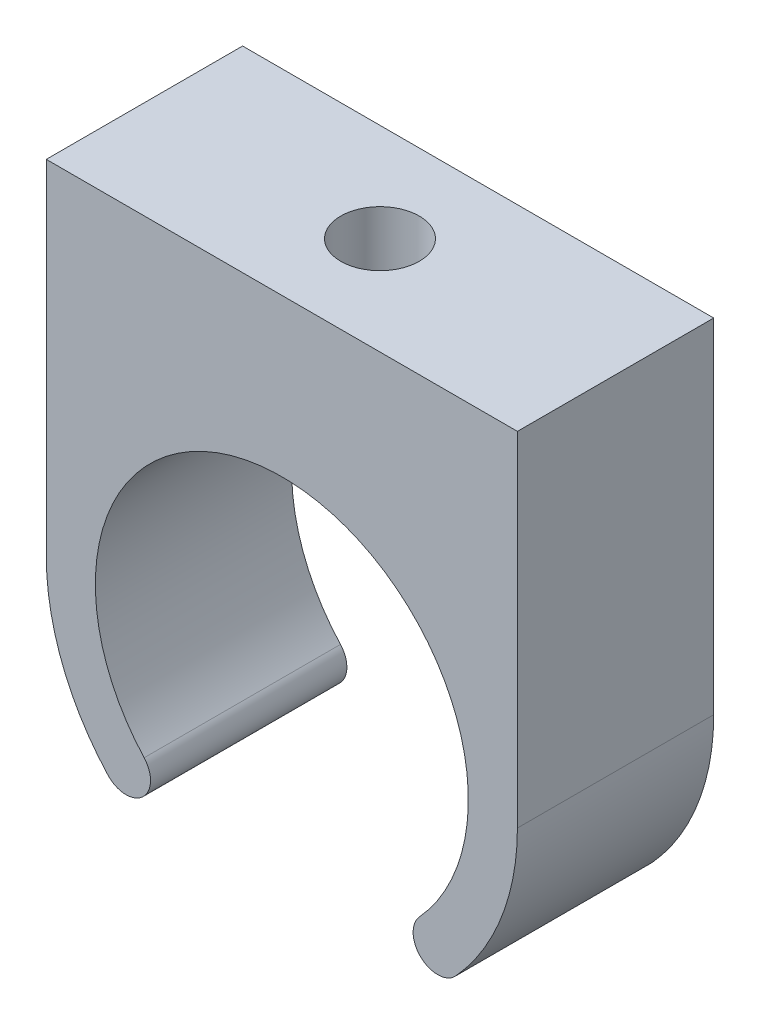
ISO-10303-21;
HEADER;
FILE_DESCRIPTION(('STEP AP214'),'2;1');
FILE_NAME('part.step','',(''),(''),'','','');
FILE_SCHEMA(('AUTOMOTIVE_DESIGN { 1 0 10303 214 1 1 1 1 }'));
ENDSEC;
DATA;
#1=APPLICATION_CONTEXT('core data for automotive mechanical design processes');
#2=APPLICATION_PROTOCOL_DEFINITION('international standard','automotive_design',2000,#1);
#3=PRODUCT_CONTEXT('',#1,'mechanical');
#4=PRODUCT('Part','Part','',(#3));
#5=PRODUCT_RELATED_PRODUCT_CATEGORY('part','',(#4));
#6=PRODUCT_DEFINITION_FORMATION('','',#4);
#7=PRODUCT_DEFINITION_CONTEXT('part definition',#1,'design');
#8=PRODUCT_DEFINITION('design','',#6,#7);
#9=PRODUCT_DEFINITION_SHAPE('','',#8);
#10=(LENGTH_UNIT() NAMED_UNIT(*) SI_UNIT(.MILLI.,.METRE.));
#11=(NAMED_UNIT(*) PLANE_ANGLE_UNIT() SI_UNIT($,.RADIAN.));
#12=(NAMED_UNIT(*) SI_UNIT($,.STERADIAN.) SOLID_ANGLE_UNIT());
#13=UNCERTAINTY_MEASURE_WITH_UNIT(LENGTH_MEASURE(1.E-05),#10,'distance_accuracy_value','');
#14=(GEOMETRIC_REPRESENTATION_CONTEXT(3) GLOBAL_UNCERTAINTY_ASSIGNED_CONTEXT((#13)) GLOBAL_UNIT_ASSIGNED_CONTEXT((#10,
#11,#12)) REPRESENTATION_CONTEXT('',''));
#15=CARTESIAN_POINT('',(0.,0.,0.));
#16=DIRECTION('',(0.,0.,1.));
#17=DIRECTION('',(1.,0.,0.));
#18=AXIS2_PLACEMENT_3D('',#15,#16,#17);
#19=CARTESIAN_POINT('',(12.,-4.5,5.));
#20=DIRECTION('',(-1.,0.,0.));
#21=DIRECTION('',(0.,-1.,0.));
#22=AXIS2_PLACEMENT_3D('',#19,#20,#21);
#23=PLANE('',#22);
#24=DIRECTION('',(0.,1.,0.));
#25=VECTOR('',#24,1.);
#26=CARTESIAN_POINT('',(12.,-4.5,-5.));
#27=LINE('',#26,#25);
#28=CARTESIAN_POINT('',(12.,-4.5,-5.));
#29=VERTEX_POINT('',#28);
#30=CARTESIAN_POINT('',(12.,13.,-5.));
#31=VERTEX_POINT('',#30);
#32=EDGE_CURVE('E249',#29,#31,#27,.T.);
#33=ORIENTED_EDGE('',*,*,#32,.T.);
#34=DIRECTION('',(0.,0.,-1.));
#35=VECTOR('',#34,1.);
#36=CARTESIAN_POINT('',(12.,13.,5.));
#37=LINE('',#36,#35);
#38=CARTESIAN_POINT('',(12.,13.,5.));
#39=VERTEX_POINT('',#38);
#40=EDGE_CURVE('E11',#39,#31,#37,.T.);
#41=ORIENTED_EDGE('',*,*,#40,.F.);
#42=DIRECTION('',(0.,1.,0.));
#43=VECTOR('',#42,1.);
#44=CARTESIAN_POINT('',(12.,-4.5,5.));
#45=LINE('',#44,#43);
#46=CARTESIAN_POINT('',(12.,-4.5,5.));
#47=VERTEX_POINT('',#46);
#48=EDGE_CURVE('E229',#47,#39,#45,.T.);
#49=ORIENTED_EDGE('',*,*,#48,.F.);
#50=DIRECTION('',(0.,0.,-1.));
#51=VECTOR('',#50,1.);
#52=CARTESIAN_POINT('',(12.,-4.5,5.));
#53=LINE('',#52,#51);
#54=EDGE_CURVE('E247',#47,#29,#53,.T.);
#55=ORIENTED_EDGE('',*,*,#54,.T.);
#56=EDGE_LOOP('',(#33,#41,#49,#55));
#57=FACE_BOUND('',#56,.T.);
#58=ADVANCED_FACE('F39',(#57),#23,.F.);
#59=CARTESIAN_POINT('',(-12.,13.,5.));
#60=DIRECTION('',(0.,-1.,0.));
#61=DIRECTION('',(0.,0.,-1.));
#62=AXIS2_PLACEMENT_3D('',#59,#60,#61);
#63=PLANE('',#62);
#64=CARTESIAN_POINT('',(0.,13.,0.));
#65=DIRECTION('',(0.,1.,0.));
#66=DIRECTION('',(0.,0.,1.));
#67=AXIS2_PLACEMENT_3D('',#64,#65,#66);
#68=CIRCLE('',#67,2.);
#69=CARTESIAN_POINT('',(0.,13.,2.));
#70=VERTEX_POINT('',#69);
#71=EDGE_CURVE('E194',#70,#70,#68,.T.);
#72=ORIENTED_EDGE('',*,*,#71,.F.);
#73=EDGE_LOOP('',(#72));
#74=FACE_BOUND('',#73,.T.);
#75=DIRECTION('',(-1.,0.,0.));
#76=VECTOR('',#75,1.);
#77=CARTESIAN_POINT('',(-12.,13.,-5.));
#78=LINE('',#77,#76);
#79=CARTESIAN_POINT('',(-12.,13.,-5.));
#80=VERTEX_POINT('',#79);
#81=EDGE_CURVE('E248',#31,#80,#78,.T.);
#82=ORIENTED_EDGE('',*,*,#81,.T.);
#83=DIRECTION('',(0.,0.,-1.));
#84=VECTOR('',#83,1.);
#85=CARTESIAN_POINT('',(-12.,13.,5.));
#86=LINE('',#85,#84);
#87=CARTESIAN_POINT('',(-12.,13.,5.));
#88=VERTEX_POINT('',#87);
#89=EDGE_CURVE('E55',#88,#80,#86,.T.);
#90=ORIENTED_EDGE('',*,*,#89,.F.);
#91=DIRECTION('',(-1.,0.,0.));
#92=VECTOR('',#91,1.);
#93=CARTESIAN_POINT('',(-12.,13.,5.));
#94=LINE('',#93,#92);
#95=EDGE_CURVE('E232',#39,#88,#94,.T.);
#96=ORIENTED_EDGE('',*,*,#95,.F.);
#97=ORIENTED_EDGE('',*,*,#40,.T.);
#98=EDGE_LOOP('',(#82,#90,#96,#97));
#99=FACE_BOUND('',#98,.T.);
#100=ADVANCED_FACE('F306',(#74,#99),#63,.F.);
#101=CARTESIAN_POINT('',(-12.,-4.5,5.));
#102=DIRECTION('',(1.,0.,0.));
#103=DIRECTION('',(0.,1.,0.));
#104=AXIS2_PLACEMENT_3D('',#101,#102,#103);
#105=PLANE('',#104);
#106=DIRECTION('',(0.,-1.,0.));
#107=VECTOR('',#106,1.);
#108=CARTESIAN_POINT('',(-12.,-4.5,-5.));
#109=LINE('',#108,#107);
#110=CARTESIAN_POINT('',(-12.,-4.5,-5.));
#111=VERTEX_POINT('',#110);
#112=EDGE_CURVE('E252',#80,#111,#109,.T.);
#113=ORIENTED_EDGE('',*,*,#112,.T.);
#114=DIRECTION('',(0.,0.,-1.));
#115=VECTOR('',#114,1.);
#116=CARTESIAN_POINT('',(-12.,-4.5,5.));
#117=LINE('',#116,#115);
#118=CARTESIAN_POINT('',(-12.,-4.5,5.));
#119=VERTEX_POINT('',#118);
#120=EDGE_CURVE('E280',#119,#111,#117,.T.);
#121=ORIENTED_EDGE('',*,*,#120,.F.);
#122=DIRECTION('',(0.,-1.,0.));
#123=VECTOR('',#122,1.);
#124=CARTESIAN_POINT('',(-12.,-4.5,5.));
#125=LINE('',#124,#123);
#126=EDGE_CURVE('E231',#88,#119,#125,.T.);
#127=ORIENTED_EDGE('',*,*,#126,.F.);
#128=ORIENTED_EDGE('',*,*,#89,.T.);
#129=EDGE_LOOP('',(#113,#121,#127,#128));
#130=FACE_BOUND('',#129,.T.);
#131=ADVANCED_FACE('F285',(#130),#105,.F.);
#132=CARTESIAN_POINT('',(0.,-4.5,5.));
#133=DIRECTION('',(0.,0.,-1.));
#134=DIRECTION('',(-1.,0.,0.));
#135=AXIS2_PLACEMENT_3D('',#132,#133,#134);
#136=CYLINDRICAL_SURFACE('',#135,12.);
#137=CARTESIAN_POINT('',(0.,-4.5,-5.));
#138=DIRECTION('',(0.,0.,1.));
#139=DIRECTION('',(1.,0.,0.));
#140=AXIS2_PLACEMENT_3D('',#137,#138,#139);
#141=CIRCLE('',#140,12.);
#142=CARTESIAN_POINT('',(-8.86019043705351,-12.593023255814,-5.));
#143=VERTEX_POINT('',#142);
#144=EDGE_CURVE('E255',#111,#143,#141,.T.);
#145=ORIENTED_EDGE('',*,*,#144,.T.);
#146=DIRECTION('',(0.,0.,-1.));
#147=VECTOR('',#146,1.);
#148=CARTESIAN_POINT('',(-8.86019043705351,-12.593023255814,5.));
#149=LINE('',#148,#147);
#150=CARTESIAN_POINT('',(-8.86019043705351,-12.593023255814,5.));
#151=VERTEX_POINT('',#150);
#152=EDGE_CURVE('E273',#151,#143,#149,.T.);
#153=ORIENTED_EDGE('',*,*,#152,.F.);
#154=CARTESIAN_POINT('',(0.,-4.5,5.));
#155=DIRECTION('',(0.,0.,1.));
#156=DIRECTION('',(1.,0.,0.));
#157=AXIS2_PLACEMENT_3D('',#154,#155,#156);
#158=CIRCLE('',#157,12.);
#159=EDGE_CURVE('E237',#119,#151,#158,.T.);
#160=ORIENTED_EDGE('',*,*,#159,.F.);
#161=ORIENTED_EDGE('',*,*,#120,.T.);
#162=EDGE_LOOP('',(#145,#153,#160,#161));
#163=FACE_BOUND('',#162,.T.);
#164=ADVANCED_FACE('F296',(#163),#136,.T.);
#165=CARTESIAN_POINT('',(-7.93725393319377,-11.75,5.));
#166=DIRECTION('',(0.,0.,-1.));
#167=DIRECTION('',(-1.,0.,0.));
#168=AXIS2_PLACEMENT_3D('',#165,#166,#167);
#169=CYLINDRICAL_SURFACE('',#168,1.25);
#170=CARTESIAN_POINT('',(-7.93725393319377,-11.75,-5.));
#171=DIRECTION('',(0.,0.,1.));
#172=DIRECTION('',(1.,0.,0.));
#173=AXIS2_PLACEMENT_3D('',#170,#171,#172);
#174=CIRCLE('',#173,1.25);
#175=CARTESIAN_POINT('',(-7.01431742933403,-10.9069767441861,-5.));
#176=VERTEX_POINT('',#175);
#177=EDGE_CURVE('E258',#143,#176,#174,.T.);
#178=ORIENTED_EDGE('',*,*,#177,.T.);
#179=DIRECTION('',(0.,0.,-1.));
#180=VECTOR('',#179,1.);
#181=CARTESIAN_POINT('',(-7.01431742933403,-10.9069767441861,5.));
#182=LINE('',#181,#180);
#183=CARTESIAN_POINT('',(-7.01431742933403,-10.9069767441861,5.));
#184=VERTEX_POINT('',#183);
#185=EDGE_CURVE('E271',#184,#176,#182,.T.);
#186=ORIENTED_EDGE('',*,*,#185,.F.);
#187=CARTESIAN_POINT('',(-7.93725393319377,-11.75,5.));
#188=DIRECTION('',(0.,0.,1.));
#189=DIRECTION('',(1.,0.,0.));
#190=AXIS2_PLACEMENT_3D('',#187,#188,#189);
#191=CIRCLE('',#190,1.25);
#192=EDGE_CURVE('E236',#151,#184,#191,.T.);
#193=ORIENTED_EDGE('',*,*,#192,.F.);
#194=ORIENTED_EDGE('',*,*,#152,.T.);
#195=EDGE_LOOP('',(#178,#186,#193,#194));
#196=FACE_BOUND('',#195,.T.);
#197=ADVANCED_FACE('F300',(#196),#169,.T.);
#198=CARTESIAN_POINT('',(0.,-4.5,5.));
#199=DIRECTION('',(0.,0.,-1.));
#200=DIRECTION('',(-1.,0.,0.));
#201=AXIS2_PLACEMENT_3D('',#198,#199,#200);
#202=CYLINDRICAL_SURFACE('',#201,9.50000000000001);
#203=CARTESIAN_POINT('',(0.,5.,2.));
#204=CARTESIAN_POINT('',(0.111027691406918,4.99999794466284,1.99999607124184));
#205=CARTESIAN_POINT('',(0.222103819697907,4.99803374011152,1.99072341258494));
#206=CARTESIAN_POINT('',(0.441107897677741,4.99038773876543,1.95391221577522));
#207=CARTESIAN_POINT('',(0.54903342154803,4.98470315241122,1.92635997129166));
#208=CARTESIAN_POINT('',(0.75853895435663,4.97025014436966,1.85388532469072));
#209=CARTESIAN_POINT('',(0.860125227252474,4.96148482551806,1.80898039524809));
#210=CARTESIAN_POINT('',(1.05431669556347,4.94181943917346,1.70312896009559));
#211=CARTESIAN_POINT('',(1.14692225767425,4.93091945889674,1.64218310973783));
#212=CARTESIAN_POINT('',(1.32191105664779,4.90799939900276,1.5050163164218));
#213=CARTESIAN_POINT('',(1.40414098477697,4.89596628673028,1.42860195147082));
#214=CARTESIAN_POINT('',(1.5547158009156,4.87222932526176,1.26308274811662));
#215=CARTESIAN_POINT('',(1.62305952179986,4.86052550381352,1.17397684406892));
#216=CARTESIAN_POINT('',(1.74458761331518,4.83864435582617,0.984484185953073));
#217=CARTESIAN_POINT('',(1.79761077433325,4.8284837610875,0.883991938755634));
#218=CARTESIAN_POINT('',(1.88595912909311,4.81102569552844,0.675274801536372));
#219=CARTESIAN_POINT('',(1.92128627263874,4.80372790929388,0.567050764929938));
#220=CARTESIAN_POINT('',(1.97273711798376,4.79295410063532,0.347599187936316));
#221=CARTESIAN_POINT('',(1.98913117149676,4.78942433018121,0.23643772602986));
#222=CARTESIAN_POINT('',(2.00309070126667,4.78642462929545,0.0128904097218117));
#223=CARTESIAN_POINT('',(2.0006583162811,4.78695423770231,-0.0994953041514237));
#224=CARTESIAN_POINT('',(1.97725203465241,4.79196471678557,-0.320305456881874));
#225=CARTESIAN_POINT('',(1.95659032965632,4.79637905513069,-0.428764725492339));
#226=CARTESIAN_POINT('',(1.89780570602233,4.80855661318396,-0.640642213120639));
#227=CARTESIAN_POINT('',(1.85968187273537,4.81632000831117,-0.744060167765435));
#228=CARTESIAN_POINT('',(1.76676342524457,4.83438760428411,-0.943806884131072));
#229=CARTESIAN_POINT('',(1.71184711583088,4.84471024508934,-1.04007729828671));
#230=CARTESIAN_POINT('',(1.58698828724243,4.86672168799341,-1.22215279263024));
#231=CARTESIAN_POINT('',(1.51704386320572,4.87841066319381,-1.3079565439714));
#232=CARTESIAN_POINT('',(1.36245319268555,4.90212443418224,-1.4684622817483));
#233=CARTESIAN_POINT('',(1.27754103078861,4.91415127237563,-1.54290808627708));
#234=CARTESIAN_POINT('',(1.09630350618647,4.93697235772125,-1.67654250571492));
#235=CARTESIAN_POINT('',(0.999977965203844,4.94776658561488,-1.73573088225649));
#236=CARTESIAN_POINT('',(0.798347946602956,4.9669373217246,-1.83722642932747));
#237=CARTESIAN_POINT('',(0.693027080487018,4.97530928967256,-1.87950195453674));
#238=CARTESIAN_POINT('',(0.476561722422704,4.98865817597072,-1.94568588832717));
#239=CARTESIAN_POINT('',(0.36541801587004,4.99363555092699,-1.9695967671881));
#240=CARTESIAN_POINT('',(0.142661179143838,4.99957007213675,-1.99800450639615));
#241=CARTESIAN_POINT('',(0.03109458810934,5.00059973479178,-2.0028515971632));
#242=CARTESIAN_POINT('',(-0.191254168004883,4.99872522451051,-1.99394073033466));
#243=CARTESIAN_POINT('',(-0.302036381746439,4.9958212977975,-1.98018393725046));
#244=CARTESIAN_POINT('',(-0.518524951939025,4.98645148769872,-1.93474649592577));
#245=CARTESIAN_POINT('',(-0.624271191689803,4.98002177185878,-1.9032477568752));
#246=CARTESIAN_POINT('',(-0.828980163564159,4.96431934896415,-1.82342106378551));
#247=CARTESIAN_POINT('',(-0.927942347168736,4.95504641235426,-1.77509175084118));
#248=CARTESIAN_POINT('',(-1.1177352139125,4.93450639350328,-1.66223358719176));
#249=CARTESIAN_POINT('',(-1.20843942082223,4.92321429613729,-1.59749669396346));
#250=CARTESIAN_POINT('',(-1.3778228093732,4.8999429226456,-1.4539370145307));
#251=CARTESIAN_POINT('',(-1.45650054987901,4.88796356440136,-1.37511254265818));
#252=CARTESIAN_POINT('',(-1.60096761890465,4.86442002668555,-1.20401364224559));
#253=CARTESIAN_POINT('',(-1.66651533299618,4.85286635532256,-1.11153350144117));
#254=CARTESIAN_POINT('',(-1.78114871532168,4.8317158615554,-0.916670780701586));
#255=CARTESIAN_POINT('',(-1.83023507526624,4.82211895693401,-0.814288617085104));
#256=CARTESIAN_POINT('',(-1.91023404895235,4.80605568943114,-0.603064952859252));
#257=CARTESIAN_POINT('',(-1.94124569603787,4.79957230236649,-0.49426231780447));
#258=CARTESIAN_POINT('',(-1.98450997561557,4.79043690813402,-0.272837680684515));
#259=CARTESIAN_POINT('',(-1.99676535636039,4.7877843396606,-0.160216240640175));
#260=CARTESIAN_POINT('',(-2.00205901839309,4.78664441918933,0.0632177269963573));
#261=CARTESIAN_POINT('',(-1.99547977904066,4.78807416506268,0.174020943674142));
#262=CARTESIAN_POINT('',(-1.96414112828371,4.79475130102583,0.392902569944554));
#263=CARTESIAN_POINT('',(-1.93938189936145,4.79999865279628,0.500981006875988));
#264=CARTESIAN_POINT('',(-1.87256463307709,4.813680825153,0.711068384555117));
#265=CARTESIAN_POINT('',(-1.83055834216923,4.82210610488688,0.813094445199554));
#266=CARTESIAN_POINT('',(-1.7304853373043,4.84119928093713,1.00870903307655));
#267=CARTESIAN_POINT('',(-1.67241709412298,4.85186739076536,1.10229675578741));
#268=CARTESIAN_POINT('',(-1.54058300352461,4.87449454781845,1.28027215313688));
#269=CARTESIAN_POINT('',(-1.46654292423916,4.88647407045748,1.36445412742039));
#270=CARTESIAN_POINT('',(-1.30542742412966,4.91023256612317,1.51932471088921));
#271=CARTESIAN_POINT('',(-1.21834900426412,4.92201149231316,1.59001020712048));
#272=CARTESIAN_POINT('',(-1.0323889870608,4.94420645110714,1.71667699825411));
#273=CARTESIAN_POINT('',(-0.933379984354339,4.95460471891947,1.77247451681065));
#274=CARTESIAN_POINT('',(-0.727194538068345,4.9726901837041,1.86654901797898));
#275=CARTESIAN_POINT('',(-0.620025269870787,4.98037972974824,1.90484119029407));
#276=CARTESIAN_POINT('',(-0.427239257105933,4.99075437069453,1.95572669428031));
#277=CARTESIAN_POINT('',(-0.34269090067951,4.9942005429971,1.97229845081316));
#278=CARTESIAN_POINT('',(-0.172104693356146,4.99882411071616,1.99443641509507));
#279=CARTESIAN_POINT('',(-0.0860668997910729,5.00000159326467,2.00000304551082));
#280=CARTESIAN_POINT('',(0.,5.,2.));
#281=B_SPLINE_CURVE_WITH_KNOTS('',3,(#203,#204,#205,#206,#207,#208,#209,#210,#211,#212,#213,
#214,#215,#216,#217,#218,#219,#220,#221,#222,#223,#224,#225,#226,#227,#228,#229,#230,#231,#232,
#233,#234,#235,#236,#237,#238,#239,#240,#241,#242,#243,#244,#245,#246,#247,#248,#249,#250,#251,
#252,#253,#254,#255,#256,#257,#258,#259,#260,#261,#262,#263,#264,#265,#266,#267,#268,#269,#270,
#271,#272,#273,#274,#275,#276,#277,#278,#279,#280),.UNSPECIFIED.,.T.,.F.,(4,2,2,2,2,2,2,2,2,2,2,
2,2,2,2,2,2,2,2,2,2,2,2,2,2,2,2,2,2,2,2,2,2,2,2,2,2,2,4),(0.,0.332768117031277,
0.665786031430695,0.998469495255918,1.33113936940165,1.6682591973254,2.00540734820485,
2.34598369082386,2.68652249939278,3.02213605752824,3.35771148920196,3.68764911424787,
4.01760402307771,4.35000918418411,4.68245650359801,5.02154876866119,5.36064633105724,
5.7003754379772,6.04005883898082,6.37347176163493,6.7068638152502,7.03689822691305,
7.36695929182639,7.70143535229663,8.03595146177539,8.37614947767226,8.71633319656386,
9.05463505055366,9.39288733028467,9.7243196575421,10.0557486580815,10.3861904535976,
10.7166637206083,11.0533410961237,11.3900960325031,11.7308334079191,12.0712745555643,
12.329241012877,12.5871975624483),.UNSPECIFIED.);
#282=CARTESIAN_POINT('',(0.,5.,2.));
#283=VERTEX_POINT('',#282);
#284=EDGE_CURVE('E45',#283,#283,#281,.T.);
#285=ORIENTED_EDGE('',*,*,#284,.T.);
#286=EDGE_LOOP('',(#285));
#287=FACE_BOUND('',#286,.T.);
#288=CARTESIAN_POINT('',(0.,-4.5,-5.));
#289=DIRECTION('',(0.,0.,-1.));
#290=DIRECTION('',(1.,0.,0.));
#291=AXIS2_PLACEMENT_3D('',#288,#289,#290);
#292=CIRCLE('',#291,9.50000000000001);
#293=CARTESIAN_POINT('',(7.01431742933404,-10.9069767441861,-5.));
#294=VERTEX_POINT('',#293);
#295=EDGE_CURVE('E256',#176,#294,#292,.T.);
#296=ORIENTED_EDGE('',*,*,#295,.T.);
#297=DIRECTION('',(0.,0.,-1.));
#298=VECTOR('',#297,1.);
#299=CARTESIAN_POINT('',(7.01431742933404,-10.9069767441861,5.));
#300=LINE('',#299,#298);
#301=CARTESIAN_POINT('',(7.01431742933404,-10.9069767441861,5.));
#302=VERTEX_POINT('',#301);
#303=EDGE_CURVE('E268',#302,#294,#300,.T.);
#304=ORIENTED_EDGE('',*,*,#303,.F.);
#305=CARTESIAN_POINT('',(0.,-4.5,5.));
#306=DIRECTION('',(0.,0.,-1.));
#307=DIRECTION('',(1.,0.,0.));
#308=AXIS2_PLACEMENT_3D('',#305,#306,#307);
#309=CIRCLE('',#308,9.50000000000001);
#310=EDGE_CURVE('E238',#184,#302,#309,.T.);
#311=ORIENTED_EDGE('',*,*,#310,.F.);
#312=ORIENTED_EDGE('',*,*,#185,.T.);
#313=EDGE_LOOP('',(#296,#304,#311,#312));
#314=FACE_BOUND('',#313,.T.);
#315=ADVANCED_FACE('F321',(#287,#314),#202,.F.);
#316=CARTESIAN_POINT('',(7.93725393319377,-11.75,5.));
#317=DIRECTION('',(0.,0.,-1.));
#318=DIRECTION('',(-1.,0.,0.));
#319=AXIS2_PLACEMENT_3D('',#316,#317,#318);
#320=CYLINDRICAL_SURFACE('',#319,1.24999999999999);
#321=CARTESIAN_POINT('',(7.93725393319377,-11.75,-5.));
#322=DIRECTION('',(0.,0.,1.));
#323=DIRECTION('',(1.,0.,0.));
#324=AXIS2_PLACEMENT_3D('',#321,#322,#323);
#325=CIRCLE('',#324,1.24999999999999);
#326=CARTESIAN_POINT('',(8.86019043705351,-12.5930232558139,-5.));
#327=VERTEX_POINT('',#326);
#328=EDGE_CURVE('E257',#294,#327,#325,.T.);
#329=ORIENTED_EDGE('',*,*,#328,.T.);
#330=DIRECTION('',(0.,0.,-1.));
#331=VECTOR('',#330,1.);
#332=CARTESIAN_POINT('',(8.86019043705351,-12.5930232558139,5.));
#333=LINE('',#332,#331);
#334=CARTESIAN_POINT('',(8.86019043705351,-12.5930232558139,5.));
#335=VERTEX_POINT('',#334);
#336=EDGE_CURVE('E264',#335,#327,#333,.T.);
#337=ORIENTED_EDGE('',*,*,#336,.F.);
#338=CARTESIAN_POINT('',(7.93725393319377,-11.75,5.));
#339=DIRECTION('',(0.,0.,1.));
#340=DIRECTION('',(1.,0.,0.));
#341=AXIS2_PLACEMENT_3D('',#338,#339,#340);
#342=CIRCLE('',#341,1.24999999999999);
#343=EDGE_CURVE('E242',#302,#335,#342,.T.);
#344=ORIENTED_EDGE('',*,*,#343,.F.);
#345=ORIENTED_EDGE('',*,*,#303,.T.);
#346=EDGE_LOOP('',(#329,#337,#344,#345));
#347=FACE_BOUND('',#346,.T.);
#348=ADVANCED_FACE('F317',(#347),#320,.T.);
#349=CARTESIAN_POINT('',(0.,-4.5,5.));
#350=DIRECTION('',(0.,0.,-1.));
#351=DIRECTION('',(-1.,0.,0.));
#352=AXIS2_PLACEMENT_3D('',#349,#350,#351);
#353=CYLINDRICAL_SURFACE('',#352,12.);
#354=CARTESIAN_POINT('',(0.,-4.5,-5.));
#355=DIRECTION('',(0.,0.,1.));
#356=DIRECTION('',(1.,0.,0.));
#357=AXIS2_PLACEMENT_3D('',#354,#355,#356);
#358=CIRCLE('',#357,12.);
#359=EDGE_CURVE('E234',#327,#29,#358,.T.);
#360=ORIENTED_EDGE('',*,*,#359,.T.);
#361=ORIENTED_EDGE('',*,*,#54,.F.);
#362=CARTESIAN_POINT('',(0.,-4.5,5.));
#363=DIRECTION('',(0.,0.,1.));
#364=DIRECTION('',(1.,0.,0.));
#365=AXIS2_PLACEMENT_3D('',#362,#363,#364);
#366=CIRCLE('',#365,12.);
#367=EDGE_CURVE('E243',#335,#47,#366,.T.);
#368=ORIENTED_EDGE('',*,*,#367,.F.);
#369=ORIENTED_EDGE('',*,*,#336,.T.);
#370=EDGE_LOOP('',(#360,#361,#368,#369));
#371=FACE_BOUND('',#370,.T.);
#372=ADVANCED_FACE('F314',(#371),#353,.T.);
#373=CARTESIAN_POINT('',(0.,-4.5,5.));
#374=DIRECTION('',(0.,0.,1.));
#375=DIRECTION('',(1.,0.,0.));
#376=AXIS2_PLACEMENT_3D('',#373,#374,#375);
#377=PLANE('',#376);
#378=ORIENTED_EDGE('',*,*,#48,.T.);
#379=ORIENTED_EDGE('',*,*,#95,.T.);
#380=ORIENTED_EDGE('',*,*,#126,.T.);
#381=ORIENTED_EDGE('',*,*,#159,.T.);
#382=ORIENTED_EDGE('',*,*,#192,.T.);
#383=ORIENTED_EDGE('',*,*,#310,.T.);
#384=ORIENTED_EDGE('',*,*,#343,.T.);
#385=ORIENTED_EDGE('',*,*,#367,.T.);
#386=EDGE_LOOP('',(#378,#379,#380,#381,#382,#383,#384,#385));
#387=FACE_BOUND('',#386,.T.);
#388=ADVANCED_FACE('F301',(#387),#377,.T.);
#389=CARTESIAN_POINT('',(0.,-4.5,-5.));
#390=DIRECTION('',(0.,0.,1.));
#391=DIRECTION('',(1.,0.,0.));
#392=AXIS2_PLACEMENT_3D('',#389,#390,#391);
#393=PLANE('',#392);
#394=DIRECTION('',(0.,-1.,0.));
#395=VECTOR('',#394,1.);
#396=CARTESIAN_POINT('',(-5.,11.1905277549736,-5.));
#397=LINE('',#396,#395);
#398=CARTESIAN_POINT('',(-5.,11.1905277549736,-5.));
#399=VERTEX_POINT('',#398);
#400=CARTESIAN_POINT('',(-5.,6.19052775497365,-5.));
#401=VERTEX_POINT('',#400);
#402=EDGE_CURVE('E186',#399,#401,#397,.T.);
#403=ORIENTED_EDGE('',*,*,#402,.F.);
#404=DIRECTION('',(1.,0.,0.));
#405=VECTOR('',#404,1.);
#406=CARTESIAN_POINT('',(-10.,11.1905277549736,-5.));
#407=LINE('',#406,#405);
#408=CARTESIAN_POINT('',(-10.,11.1905277549736,-5.));
#409=VERTEX_POINT('',#408);
#410=EDGE_CURVE('E56',#409,#399,#407,.T.);
#411=ORIENTED_EDGE('',*,*,#410,.F.);
#412=DIRECTION('',(0.,1.,0.));
#413=VECTOR('',#412,1.);
#414=CARTESIAN_POINT('',(-10.,11.1905277549736,-5.));
#415=LINE('',#414,#413);
#416=CARTESIAN_POINT('',(-10.,1.19052775497365,-5.));
#417=VERTEX_POINT('',#416);
#418=EDGE_CURVE('E179',#417,#409,#415,.T.);
#419=ORIENTED_EDGE('',*,*,#418,.F.);
#420=CARTESIAN_POINT('',(-4.99999999999999,1.19052775497364,-5.));
#421=DIRECTION('',(0.,0.,1.));
#422=DIRECTION('',(1.,0.,0.));
#423=AXIS2_PLACEMENT_3D('',#420,#421,#422);
#424=CIRCLE('',#423,5.00000000000001);
#425=EDGE_CURVE('E178',#401,#417,#424,.T.);
#426=ORIENTED_EDGE('',*,*,#425,.F.);
#427=EDGE_LOOP('',(#403,#411,#419,#426));
#428=FACE_BOUND('',#427,.T.);
#429=DIRECTION('',(0.,1.,0.));
#430=VECTOR('',#429,1.);
#431=CARTESIAN_POINT('',(5.,11.1905277549736,-5.));
#432=LINE('',#431,#430);
#433=CARTESIAN_POINT('',(5.,6.19052775497365,-5.));
#434=VERTEX_POINT('',#433);
#435=CARTESIAN_POINT('',(5.,11.1905277549736,-5.));
#436=VERTEX_POINT('',#435);
#437=EDGE_CURVE('E215',#434,#436,#432,.T.);
#438=ORIENTED_EDGE('',*,*,#437,.F.);
#439=CARTESIAN_POINT('',(4.99999999999999,1.19052775497364,-5.));
#440=DIRECTION('',(0.,0.,1.));
#441=DIRECTION('',(-1.,0.,0.));
#442=AXIS2_PLACEMENT_3D('',#439,#440,#441);
#443=CIRCLE('',#442,5.00000000000001);
#444=CARTESIAN_POINT('',(10.,1.19052775497365,-5.));
#445=VERTEX_POINT('',#444);
#446=EDGE_CURVE('E69',#445,#434,#443,.T.);
#447=ORIENTED_EDGE('',*,*,#446,.F.);
#448=DIRECTION('',(0.,-1.,0.));
#449=VECTOR('',#448,1.);
#450=CARTESIAN_POINT('',(10.,11.1905277549736,-5.));
#451=LINE('',#450,#449);
#452=CARTESIAN_POINT('',(10.,11.1905277549736,-5.));
#453=VERTEX_POINT('',#452);
#454=EDGE_CURVE('E202',#453,#445,#451,.T.);
#455=ORIENTED_EDGE('',*,*,#454,.F.);
#456=DIRECTION('',(1.,0.,0.));
#457=VECTOR('',#456,1.);
#458=CARTESIAN_POINT('',(10.,11.1905277549736,-5.));
#459=LINE('',#458,#457);
#460=EDGE_CURVE('E208',#436,#453,#459,.T.);
#461=ORIENTED_EDGE('',*,*,#460,.F.);
#462=EDGE_LOOP('',(#438,#447,#455,#461));
#463=FACE_BOUND('',#462,.T.);
#464=ORIENTED_EDGE('',*,*,#32,.F.);
#465=ORIENTED_EDGE('',*,*,#359,.F.);
#466=ORIENTED_EDGE('',*,*,#328,.F.);
#467=ORIENTED_EDGE('',*,*,#295,.F.);
#468=ORIENTED_EDGE('',*,*,#177,.F.);
#469=ORIENTED_EDGE('',*,*,#144,.F.);
#470=ORIENTED_EDGE('',*,*,#112,.F.);
#471=ORIENTED_EDGE('',*,*,#81,.F.);
#472=EDGE_LOOP('',(#464,#465,#466,#467,#468,#469,#470,#471));
#473=FACE_BOUND('',#472,.T.);
#474=ADVANCED_FACE('F292',(#428,#463,#473),#393,.F.);
#475=CARTESIAN_POINT('',(0.,4.00000000000002,0.));
#476=DIRECTION('',(0.,1.,0.));
#477=DIRECTION('',(0.,0.,1.));
#478=AXIS2_PLACEMENT_3D('',#475,#476,#477);
#479=CYLINDRICAL_SURFACE('',#478,2.);
#480=ORIENTED_EDGE('',*,*,#71,.T.);
#481=EDGE_LOOP('',(#480));
#482=FACE_BOUND('',#481,.T.);
#483=ORIENTED_EDGE('',*,*,#284,.F.);
#484=EDGE_LOOP('',(#483));
#485=FACE_BOUND('',#484,.T.);
#486=ADVANCED_FACE('F384',(#482,#485),#479,.F.);
#487=CARTESIAN_POINT('',(4.99999999999999,1.19052775497364,3.));
#488=DIRECTION('',(0.,0.,-1.));
#489=DIRECTION('',(-1.,0.,0.));
#490=AXIS2_PLACEMENT_3D('',#487,#488,#489);
#491=CYLINDRICAL_SURFACE('',#490,5.00000000000001);
#492=ORIENTED_EDGE('',*,*,#446,.T.);
#493=DIRECTION('',(0.,0.,-1.));
#494=VECTOR('',#493,1.);
#495=CARTESIAN_POINT('',(5.,6.19052775497365,3.));
#496=LINE('',#495,#494);
#497=CARTESIAN_POINT('',(5.,6.19052775497365,3.));
#498=VERTEX_POINT('',#497);
#499=EDGE_CURVE('E198',#498,#434,#496,.T.);
#500=ORIENTED_EDGE('',*,*,#499,.F.);
#501=CARTESIAN_POINT('',(4.99999999999999,1.19052775497364,3.));
#502=DIRECTION('',(0.,0.,1.));
#503=DIRECTION('',(-1.,0.,0.));
#504=AXIS2_PLACEMENT_3D('',#501,#502,#503);
#505=CIRCLE('',#504,5.00000000000001);
#506=CARTESIAN_POINT('',(10.,1.19052775497365,3.));
#507=VERTEX_POINT('',#506);
#508=EDGE_CURVE('E207',#507,#498,#505,.T.);
#509=ORIENTED_EDGE('',*,*,#508,.F.);
#510=DIRECTION('',(0.,0.,-1.));
#511=VECTOR('',#510,1.);
#512=CARTESIAN_POINT('',(10.,1.19052775497365,3.));
#513=LINE('',#512,#511);
#514=EDGE_CURVE('E201',#507,#445,#513,.T.);
#515=ORIENTED_EDGE('',*,*,#514,.T.);
#516=EDGE_LOOP('',(#492,#500,#509,#515));
#517=FACE_BOUND('',#516,.T.);
#518=ADVANCED_FACE('F400',(#517),#491,.T.);
#519=CARTESIAN_POINT('',(10.,11.1905277549736,3.));
#520=DIRECTION('',(1.,0.,0.));
#521=DIRECTION('',(0.,1.,0.));
#522=AXIS2_PLACEMENT_3D('',#519,#520,#521);
#523=PLANE('',#522);
#524=ORIENTED_EDGE('',*,*,#454,.T.);
#525=ORIENTED_EDGE('',*,*,#514,.F.);
#526=DIRECTION('',(0.,-1.,0.));
#527=VECTOR('',#526,1.);
#528=CARTESIAN_POINT('',(10.,11.1905277549736,3.));
#529=LINE('',#528,#527);
#530=CARTESIAN_POINT('',(10.,11.1905277549736,3.));
#531=VERTEX_POINT('',#530);
#532=EDGE_CURVE('E196',#531,#507,#529,.T.);
#533=ORIENTED_EDGE('',*,*,#532,.F.);
#534=DIRECTION('',(0.,0.,-1.));
#535=VECTOR('',#534,1.);
#536=CARTESIAN_POINT('',(10.,11.1905277549736,3.));
#537=LINE('',#536,#535);
#538=EDGE_CURVE('E203',#531,#453,#537,.T.);
#539=ORIENTED_EDGE('',*,*,#538,.T.);
#540=EDGE_LOOP('',(#524,#525,#533,#539));
#541=FACE_BOUND('',#540,.T.);
#542=ADVANCED_FACE('F406',(#541),#523,.F.);
#543=CARTESIAN_POINT('',(10.,11.1905277549736,3.));
#544=DIRECTION('',(0.,1.,0.));
#545=DIRECTION('',(0.,0.,1.));
#546=AXIS2_PLACEMENT_3D('',#543,#544,#545);
#547=PLANE('',#546);
#548=ORIENTED_EDGE('',*,*,#460,.T.);
#549=ORIENTED_EDGE('',*,*,#538,.F.);
#550=DIRECTION('',(1.,0.,0.));
#551=VECTOR('',#550,1.);
#552=CARTESIAN_POINT('',(10.,11.1905277549736,3.));
#553=LINE('',#552,#551);
#554=CARTESIAN_POINT('',(5.,11.1905277549736,3.));
#555=VERTEX_POINT('',#554);
#556=EDGE_CURVE('E217',#555,#531,#553,.T.);
#557=ORIENTED_EDGE('',*,*,#556,.F.);
#558=DIRECTION('',(0.,0.,-1.));
#559=VECTOR('',#558,1.);
#560=CARTESIAN_POINT('',(5.,11.1905277549736,3.));
#561=LINE('',#560,#559);
#562=EDGE_CURVE('E200',#555,#436,#561,.T.);
#563=ORIENTED_EDGE('',*,*,#562,.T.);
#564=EDGE_LOOP('',(#548,#549,#557,#563));
#565=FACE_BOUND('',#564,.T.);
#566=ADVANCED_FACE('F413',(#565),#547,.F.);
#567=CARTESIAN_POINT('',(5.,11.1905277549736,3.));
#568=DIRECTION('',(-1.,0.,0.));
#569=DIRECTION('',(0.,-1.,0.));
#570=AXIS2_PLACEMENT_3D('',#567,#568,#569);
#571=PLANE('',#570);
#572=ORIENTED_EDGE('',*,*,#437,.T.);
#573=ORIENTED_EDGE('',*,*,#562,.F.);
#574=DIRECTION('',(0.,1.,0.));
#575=VECTOR('',#574,1.);
#576=CARTESIAN_POINT('',(5.,11.1905277549736,3.));
#577=LINE('',#576,#575);
#578=EDGE_CURVE('E222',#498,#555,#577,.T.);
#579=ORIENTED_EDGE('',*,*,#578,.F.);
#580=ORIENTED_EDGE('',*,*,#499,.T.);
#581=EDGE_LOOP('',(#572,#573,#579,#580));
#582=FACE_BOUND('',#581,.T.);
#583=ADVANCED_FACE('F422',(#582),#571,.F.);
#584=CARTESIAN_POINT('',(4.99999999999999,1.19052775497364,3.));
#585=DIRECTION('',(0.,0.,-1.));
#586=DIRECTION('',(-1.,0.,0.));
#587=AXIS2_PLACEMENT_3D('',#584,#585,#586);
#588=PLANE('',#587);
#589=ORIENTED_EDGE('',*,*,#508,.T.);
#590=ORIENTED_EDGE('',*,*,#578,.T.);
#591=ORIENTED_EDGE('',*,*,#556,.T.);
#592=ORIENTED_EDGE('',*,*,#532,.T.);
#593=EDGE_LOOP('',(#589,#590,#591,#592));
#594=FACE_BOUND('',#593,.T.);
#595=ADVANCED_FACE('F434',(#594),#588,.T.);
#596=CARTESIAN_POINT('',(-10.,11.1905277549736,3.));
#597=DIRECTION('',(0.,1.,0.));
#598=DIRECTION('',(0.,0.,1.));
#599=AXIS2_PLACEMENT_3D('',#596,#597,#598);
#600=PLANE('',#599);
#601=ORIENTED_EDGE('',*,*,#410,.T.);
#602=DIRECTION('',(0.,0.,-1.));
#603=VECTOR('',#602,1.);
#604=CARTESIAN_POINT('',(-5.,11.1905277549736,3.));
#605=LINE('',#604,#603);
#606=CARTESIAN_POINT('',(-5.,11.1905277549736,3.));
#607=VERTEX_POINT('',#606);
#608=EDGE_CURVE('E154',#607,#399,#605,.T.);
#609=ORIENTED_EDGE('',*,*,#608,.F.);
#610=DIRECTION('',(1.,0.,0.));
#611=VECTOR('',#610,1.);
#612=CARTESIAN_POINT('',(-10.,11.1905277549736,3.));
#613=LINE('',#612,#611);
#614=CARTESIAN_POINT('',(-10.,11.1905277549736,3.));
#615=VERTEX_POINT('',#614);
#616=EDGE_CURVE('E157',#615,#607,#613,.T.);
#617=ORIENTED_EDGE('',*,*,#616,.F.);
#618=DIRECTION('',(0.,0.,-1.));
#619=VECTOR('',#618,1.);
#620=CARTESIAN_POINT('',(-10.,11.1905277549736,3.));
#621=LINE('',#620,#619);
#622=EDGE_CURVE('E190',#615,#409,#621,.T.);
#623=ORIENTED_EDGE('',*,*,#622,.T.);
#624=EDGE_LOOP('',(#601,#609,#617,#623));
#625=FACE_BOUND('',#624,.T.);
#626=ADVANCED_FACE('F160',(#625),#600,.F.);
#627=CARTESIAN_POINT('',(-10.,11.1905277549736,3.));
#628=DIRECTION('',(-1.,0.,0.));
#629=DIRECTION('',(0.,-1.,0.));
#630=AXIS2_PLACEMENT_3D('',#627,#628,#629);
#631=PLANE('',#630);
#632=ORIENTED_EDGE('',*,*,#418,.T.);
#633=ORIENTED_EDGE('',*,*,#622,.F.);
#634=DIRECTION('',(0.,1.,0.));
#635=VECTOR('',#634,1.);
#636=CARTESIAN_POINT('',(-10.,11.1905277549736,3.));
#637=LINE('',#636,#635);
#638=CARTESIAN_POINT('',(-10.,1.19052775497365,3.));
#639=VERTEX_POINT('',#638);
#640=EDGE_CURVE('E164',#639,#615,#637,.T.);
#641=ORIENTED_EDGE('',*,*,#640,.F.);
#642=DIRECTION('',(0.,0.,-1.));
#643=VECTOR('',#642,1.);
#644=CARTESIAN_POINT('',(-10.,1.19052775497365,3.));
#645=LINE('',#644,#643);
#646=EDGE_CURVE('E195',#639,#417,#645,.T.);
#647=ORIENTED_EDGE('',*,*,#646,.T.);
#648=EDGE_LOOP('',(#632,#633,#641,#647));
#649=FACE_BOUND('',#648,.T.);
#650=ADVANCED_FACE('F451',(#649),#631,.F.);
#651=CARTESIAN_POINT('',(-4.99999999999999,1.19052775497364,3.));
#652=DIRECTION('',(0.,0.,-1.));
#653=DIRECTION('',(-1.,0.,0.));
#654=AXIS2_PLACEMENT_3D('',#651,#652,#653);
#655=CYLINDRICAL_SURFACE('',#654,5.00000000000001);
#656=ORIENTED_EDGE('',*,*,#425,.T.);
#657=ORIENTED_EDGE('',*,*,#646,.F.);
#658=CARTESIAN_POINT('',(-4.99999999999999,1.19052775497364,3.));
#659=DIRECTION('',(0.,0.,1.));
#660=DIRECTION('',(1.,0.,0.));
#661=AXIS2_PLACEMENT_3D('',#658,#659,#660);
#662=CIRCLE('',#661,5.00000000000001);
#663=CARTESIAN_POINT('',(-5.,6.19052775497365,3.));
#664=VERTEX_POINT('',#663);
#665=EDGE_CURVE('E174',#664,#639,#662,.T.);
#666=ORIENTED_EDGE('',*,*,#665,.F.);
#667=DIRECTION('',(0.,0.,-1.));
#668=VECTOR('',#667,1.);
#669=CARTESIAN_POINT('',(-5.,6.19052775497365,3.));
#670=LINE('',#669,#668);
#671=EDGE_CURVE('E163',#664,#401,#670,.T.);
#672=ORIENTED_EDGE('',*,*,#671,.T.);
#673=EDGE_LOOP('',(#656,#657,#666,#672));
#674=FACE_BOUND('',#673,.T.);
#675=ADVANCED_FACE('F464',(#674),#655,.T.);
#676=CARTESIAN_POINT('',(-5.,11.1905277549736,3.));
#677=DIRECTION('',(1.,0.,0.));
#678=DIRECTION('',(0.,1.,0.));
#679=AXIS2_PLACEMENT_3D('',#676,#677,#678);
#680=PLANE('',#679);
#681=ORIENTED_EDGE('',*,*,#402,.T.);
#682=ORIENTED_EDGE('',*,*,#671,.F.);
#683=DIRECTION('',(0.,-1.,0.));
#684=VECTOR('',#683,1.);
#685=CARTESIAN_POINT('',(-5.,11.1905277549736,3.));
#686=LINE('',#685,#684);
#687=EDGE_CURVE('E169',#607,#664,#686,.T.);
#688=ORIENTED_EDGE('',*,*,#687,.F.);
#689=ORIENTED_EDGE('',*,*,#608,.T.);
#690=EDGE_LOOP('',(#681,#682,#688,#689));
#691=FACE_BOUND('',#690,.T.);
#692=ADVANCED_FACE('F166',(#691),#680,.F.);
#693=CARTESIAN_POINT('',(-4.99999999999999,1.19052775497364,3.));
#694=DIRECTION('',(0.,0.,1.));
#695=DIRECTION('',(1.,0.,0.));
#696=AXIS2_PLACEMENT_3D('',#693,#694,#695);
#697=PLANE('',#696);
#698=ORIENTED_EDGE('',*,*,#616,.T.);
#699=ORIENTED_EDGE('',*,*,#687,.T.);
#700=ORIENTED_EDGE('',*,*,#665,.T.);
#701=ORIENTED_EDGE('',*,*,#640,.T.);
#702=EDGE_LOOP('',(#698,#699,#700,#701));
#703=FACE_BOUND('',#702,.T.);
#704=ADVANCED_FACE('F175',(#703),#697,.F.);
#705=CLOSED_SHELL('',(#58,#100,#131,#164,#197,#315,#348,#372,#388,#474,#486,#518,#542,#566,#583,
#595,#626,#650,#675,#692,#704));
#706=MANIFOLD_SOLID_BREP('B2',#705);
#707=ADVANCED_BREP_SHAPE_REPRESENTATION('',(#18,#706),#14);
#708=SHAPE_DEFINITION_REPRESENTATION(#9,#707);
ENDSEC;
END-ISO-10303-21;
